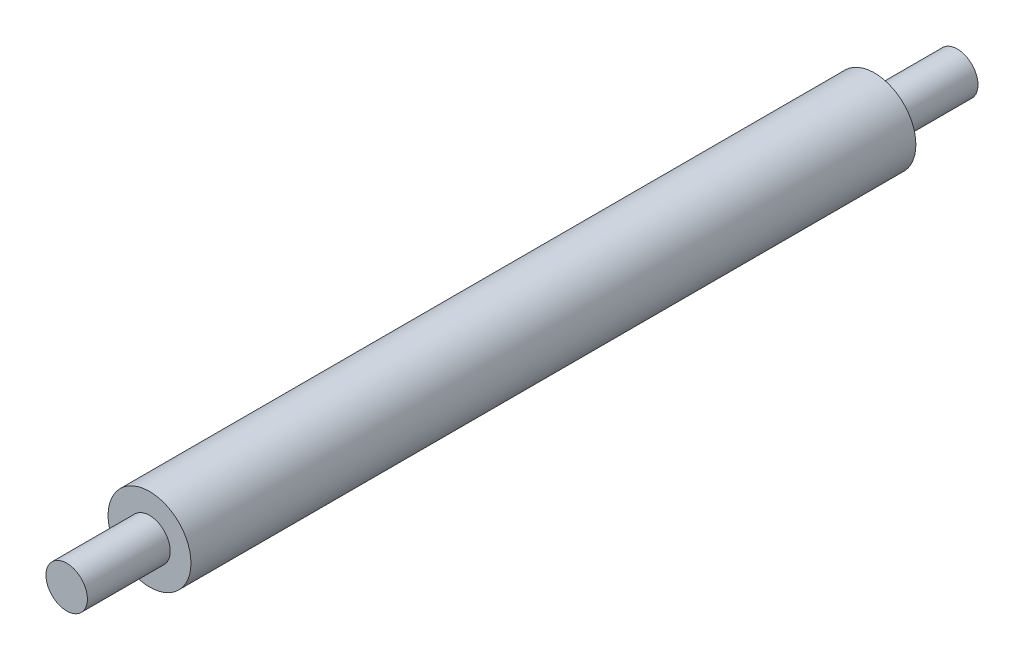
ISO-10303-21;
HEADER;
FILE_DESCRIPTION(('STEP AP214'),'2;1');
FILE_NAME('part.step','',(''),(''),'','','');
FILE_SCHEMA(('AUTOMOTIVE_DESIGN { 1 0 10303 214 1 1 1 1 }'));
ENDSEC;
DATA;
#1=APPLICATION_CONTEXT('core data for automotive mechanical design processes');
#2=APPLICATION_PROTOCOL_DEFINITION('international standard','automotive_design',2000,#1);
#3=PRODUCT_CONTEXT('',#1,'mechanical');
#4=PRODUCT('Part','Part','',(#3));
#5=PRODUCT_RELATED_PRODUCT_CATEGORY('part','',(#4));
#6=PRODUCT_DEFINITION_FORMATION('','',#4);
#7=PRODUCT_DEFINITION_CONTEXT('part definition',#1,'design');
#8=PRODUCT_DEFINITION('design','',#6,#7);
#9=PRODUCT_DEFINITION_SHAPE('','',#8);
#10=(LENGTH_UNIT() NAMED_UNIT(*) SI_UNIT(.MILLI.,.METRE.));
#11=(NAMED_UNIT(*) PLANE_ANGLE_UNIT() SI_UNIT($,.RADIAN.));
#12=(NAMED_UNIT(*) SI_UNIT($,.STERADIAN.) SOLID_ANGLE_UNIT());
#13=UNCERTAINTY_MEASURE_WITH_UNIT(LENGTH_MEASURE(1.E-05),#10,'distance_accuracy_value','');
#14=(GEOMETRIC_REPRESENTATION_CONTEXT(3) GLOBAL_UNCERTAINTY_ASSIGNED_CONTEXT((#13)) GLOBAL_UNIT_ASSIGNED_CONTEXT((#10,
#11,#12)) REPRESENTATION_CONTEXT('',''));
#15=CARTESIAN_POINT('',(0.,0.,0.));
#16=DIRECTION('',(0.,0.,1.));
#17=DIRECTION('',(1.,0.,0.));
#18=AXIS2_PLACEMENT_3D('',#15,#16,#17);
#19=CARTESIAN_POINT('',(0.,0.,87.5));
#20=DIRECTION('',(0.,0.,-1.));
#21=DIRECTION('',(-1.,0.,0.));
#22=AXIS2_PLACEMENT_3D('',#19,#20,#21);
#23=CYLINDRICAL_SURFACE('',#22,10.);
#24=CARTESIAN_POINT('',(0.,0.,87.5));
#25=DIRECTION('',(0.,0.,1.));
#26=DIRECTION('',(1.,0.,0.));
#27=AXIS2_PLACEMENT_3D('',#24,#25,#26);
#28=CIRCLE('',#27,10.);
#29=CARTESIAN_POINT('',(10.,0.,87.5));
#30=VERTEX_POINT('',#29);
#31=EDGE_CURVE('E45',#30,#30,#28,.T.);
#32=ORIENTED_EDGE('',*,*,#31,.F.);
#33=EDGE_LOOP('',(#32));
#34=FACE_BOUND('',#33,.T.);
#35=CARTESIAN_POINT('',(0.,0.,-87.5));
#36=DIRECTION('',(0.,0.,1.));
#37=DIRECTION('',(1.,0.,0.));
#38=AXIS2_PLACEMENT_3D('',#35,#36,#37);
#39=CIRCLE('',#38,10.);
#40=CARTESIAN_POINT('',(10.,0.,-87.5));
#41=VERTEX_POINT('',#40);
#42=EDGE_CURVE('E40',#41,#41,#39,.T.);
#43=ORIENTED_EDGE('',*,*,#42,.T.);
#44=EDGE_LOOP('',(#43));
#45=FACE_BOUND('',#44,.T.);
#46=ADVANCED_FACE('F37',(#34,#45),#23,.T.);
#47=CARTESIAN_POINT('',(0.,0.,87.5));
#48=DIRECTION('',(0.,0.,1.));
#49=DIRECTION('',(1.,0.,0.));
#50=AXIS2_PLACEMENT_3D('',#47,#48,#49);
#51=PLANE('',#50);
#52=CARTESIAN_POINT('',(0.,0.,87.5));
#53=DIRECTION('',(0.,0.,1.));
#54=DIRECTION('',(1.,0.,0.));
#55=AXIS2_PLACEMENT_3D('',#52,#53,#54);
#56=CIRCLE('',#55,5.);
#57=CARTESIAN_POINT('',(5.,0.,87.5));
#58=VERTEX_POINT('',#57);
#59=EDGE_CURVE('E10',#58,#58,#56,.T.);
#60=ORIENTED_EDGE('',*,*,#59,.F.);
#61=EDGE_LOOP('',(#60));
#62=FACE_BOUND('',#61,.T.);
#63=ORIENTED_EDGE('',*,*,#31,.T.);
#64=EDGE_LOOP('',(#63));
#65=FACE_BOUND('',#64,.T.);
#66=ADVANCED_FACE('F77',(#62,#65),#51,.T.);
#67=CARTESIAN_POINT('',(0.,0.,-87.5));
#68=DIRECTION('',(0.,0.,1.));
#69=DIRECTION('',(1.,0.,0.));
#70=AXIS2_PLACEMENT_3D('',#67,#68,#69);
#71=PLANE('',#70);
#72=CARTESIAN_POINT('',(0.,0.,-87.5));
#73=DIRECTION('',(0.,0.,1.));
#74=DIRECTION('',(1.,0.,0.));
#75=AXIS2_PLACEMENT_3D('',#72,#73,#74);
#76=CIRCLE('',#75,5.);
#77=CARTESIAN_POINT('',(5.,0.,-87.5));
#78=VERTEX_POINT('',#77);
#79=EDGE_CURVE('E57',#78,#78,#76,.T.);
#80=ORIENTED_EDGE('',*,*,#79,.T.);
#81=EDGE_LOOP('',(#80));
#82=FACE_BOUND('',#81,.T.);
#83=ORIENTED_EDGE('',*,*,#42,.F.);
#84=EDGE_LOOP('',(#83));
#85=FACE_BOUND('',#84,.T.);
#86=ADVANCED_FACE('F82',(#82,#85),#71,.F.);
#87=CARTESIAN_POINT('',(0.,0.,107.5));
#88=DIRECTION('',(0.,0.,-1.));
#89=DIRECTION('',(-1.,0.,0.));
#90=AXIS2_PLACEMENT_3D('',#87,#88,#89);
#91=CYLINDRICAL_SURFACE('',#90,5.);
#92=CARTESIAN_POINT('',(0.,0.,107.5));
#93=DIRECTION('',(0.,0.,1.));
#94=DIRECTION('',(1.,0.,0.));
#95=AXIS2_PLACEMENT_3D('',#92,#93,#94);
#96=CIRCLE('',#95,5.);
#97=CARTESIAN_POINT('',(5.,0.,107.5));
#98=VERTEX_POINT('',#97);
#99=EDGE_CURVE('E52',#98,#98,#96,.T.);
#100=ORIENTED_EDGE('',*,*,#99,.F.);
#101=EDGE_LOOP('',(#100));
#102=FACE_BOUND('',#101,.T.);
#103=ORIENTED_EDGE('',*,*,#59,.T.);
#104=EDGE_LOOP('',(#103));
#105=FACE_BOUND('',#104,.T.);
#106=ADVANCED_FACE('F92',(#102,#105),#91,.T.);
#107=CARTESIAN_POINT('',(0.,0.,107.5));
#108=DIRECTION('',(0.,0.,1.));
#109=DIRECTION('',(1.,0.,0.));
#110=AXIS2_PLACEMENT_3D('',#107,#108,#109);
#111=PLANE('',#110);
#112=ORIENTED_EDGE('',*,*,#99,.T.);
#113=EDGE_LOOP('',(#112));
#114=FACE_BOUND('',#113,.T.);
#115=ADVANCED_FACE('F74',(#114),#111,.T.);
#116=CARTESIAN_POINT('',(0.,0.,-107.5));
#117=DIRECTION('',(0.,0.,1.));
#118=DIRECTION('',(1.,0.,0.));
#119=AXIS2_PLACEMENT_3D('',#116,#117,#118);
#120=CYLINDRICAL_SURFACE('',#119,5.);
#121=CARTESIAN_POINT('',(0.,0.,-107.5));
#122=DIRECTION('',(0.,0.,1.));
#123=DIRECTION('',(1.,0.,0.));
#124=AXIS2_PLACEMENT_3D('',#121,#122,#123);
#125=CIRCLE('',#124,5.);
#126=CARTESIAN_POINT('',(5.,0.,-107.5));
#127=VERTEX_POINT('',#126);
#128=EDGE_CURVE('E56',#127,#127,#125,.T.);
#129=ORIENTED_EDGE('',*,*,#128,.T.);
#130=EDGE_LOOP('',(#129));
#131=FACE_BOUND('',#130,.T.);
#132=ORIENTED_EDGE('',*,*,#79,.F.);
#133=EDGE_LOOP('',(#132));
#134=FACE_BOUND('',#133,.T.);
#135=ADVANCED_FACE('F65',(#131,#134),#120,.T.);
#136=CARTESIAN_POINT('',(0.,0.,-107.5));
#137=DIRECTION('',(0.,0.,-1.));
#138=DIRECTION('',(1.,0.,0.));
#139=AXIS2_PLACEMENT_3D('',#136,#137,#138);
#140=PLANE('',#139);
#141=ORIENTED_EDGE('',*,*,#128,.F.);
#142=EDGE_LOOP('',(#141));
#143=FACE_BOUND('',#142,.T.);
#144=ADVANCED_FACE('F68',(#143),#140,.T.);
#145=CLOSED_SHELL('',(#46,#66,#86,#106,#115,#135,#144));
#146=MANIFOLD_SOLID_BREP('B2',#145);
#147=ADVANCED_BREP_SHAPE_REPRESENTATION('',(#18,#146),#14);
#148=SHAPE_DEFINITION_REPRESENTATION(#9,#147);
ENDSEC;
END-ISO-10303-21;
